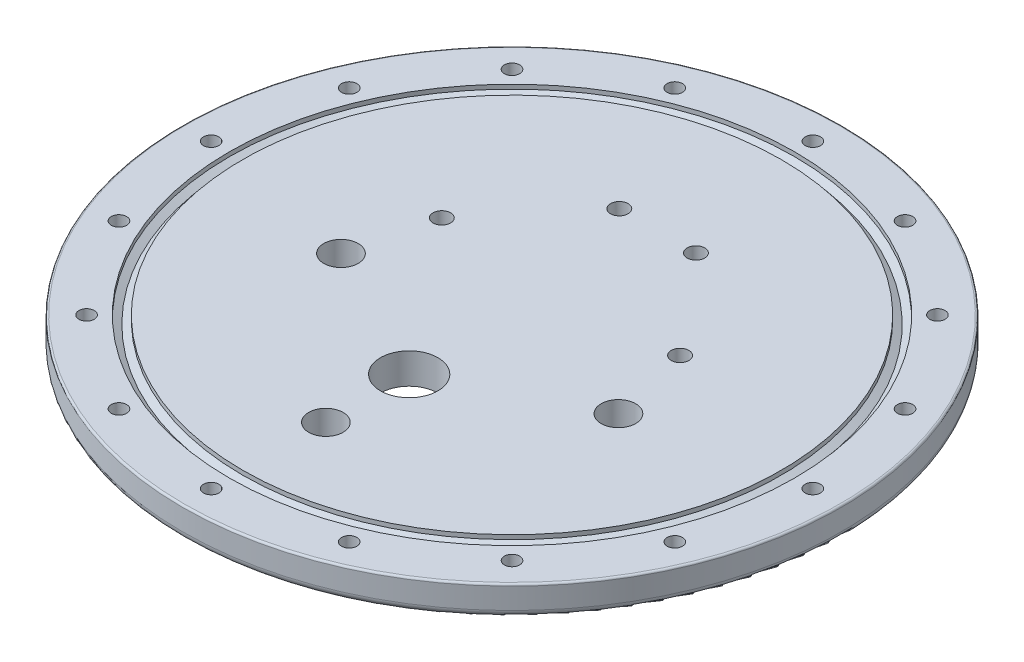
ISO-10303-21;
HEADER;
FILE_DESCRIPTION(('STEP AP214'),'2;1');
FILE_NAME('part.step','',(''),(''),'','','');
FILE_SCHEMA(('AUTOMOTIVE_DESIGN { 1 0 10303 214 1 1 1 1 }'));
ENDSEC;
DATA;
#1=APPLICATION_CONTEXT('core data for automotive mechanical design processes');
#2=APPLICATION_PROTOCOL_DEFINITION('international standard','automotive_design',2000,#1);
#3=PRODUCT_CONTEXT('',#1,'mechanical');
#4=PRODUCT('Part','Part','',(#3));
#5=PRODUCT_RELATED_PRODUCT_CATEGORY('part','',(#4));
#6=PRODUCT_DEFINITION_FORMATION('','',#4);
#7=PRODUCT_DEFINITION_CONTEXT('part definition',#1,'design');
#8=PRODUCT_DEFINITION('design','',#6,#7);
#9=PRODUCT_DEFINITION_SHAPE('','',#8);
#10=(LENGTH_UNIT() NAMED_UNIT(*) SI_UNIT(.MILLI.,.METRE.));
#11=(NAMED_UNIT(*) PLANE_ANGLE_UNIT() SI_UNIT($,.RADIAN.));
#12=(NAMED_UNIT(*) SI_UNIT($,.STERADIAN.) SOLID_ANGLE_UNIT());
#13=UNCERTAINTY_MEASURE_WITH_UNIT(LENGTH_MEASURE(1.E-05),#10,'distance_accuracy_value','');
#14=(GEOMETRIC_REPRESENTATION_CONTEXT(3) GLOBAL_UNCERTAINTY_ASSIGNED_CONTEXT((#13)) GLOBAL_UNIT_ASSIGNED_CONTEXT((#10,
#11,#12)) REPRESENTATION_CONTEXT('',''));
#15=CARTESIAN_POINT('',(0.,0.,0.));
#16=DIRECTION('',(0.,0.,1.));
#17=DIRECTION('',(1.,0.,0.));
#18=AXIS2_PLACEMENT_3D('',#15,#16,#17);
#19=CARTESIAN_POINT('',(0.,8.,0.));
#20=DIRECTION('',(0.,1.,0.));
#21=DIRECTION('',(0.,0.,1.));
#22=AXIS2_PLACEMENT_3D('',#19,#20,#21);
#23=PLANE('',#22);
#24=CARTESIAN_POINT('',(0.,8.,0.));
#25=DIRECTION('',(0.,1.,0.));
#26=DIRECTION('',(0.,0.,1.));
#27=AXIS2_PLACEMENT_3D('',#24,#25,#26);
#28=CIRCLE('',#27,85.5);
#29=CARTESIAN_POINT('',(0.,8.,85.5));
#30=VERTEX_POINT('',#29);
#31=EDGE_CURVE('E47',#30,#30,#28,.T.);
#32=ORIENTED_EDGE('',*,*,#31,.T.);
#33=EDGE_LOOP('',(#32));
#34=FACE_BOUND('',#33,.T.);
#35=CARTESIAN_POINT('',(-30.0406494406596,8.,-72.524543302136));
#36=DIRECTION('',(0.,1.,0.));
#37=DIRECTION('',(0.,0.,1.));
#38=AXIS2_PLACEMENT_3D('',#35,#36,#37);
#39=CIRCLE('',#38,2.);
#40=CARTESIAN_POINT('',(-30.0406494406596,8.,-70.524543302136));
#41=VERTEX_POINT('',#40);
#42=EDGE_CURVE('E69',#41,#41,#39,.T.);
#43=ORIENTED_EDGE('',*,*,#42,.F.);
#44=EDGE_LOOP('',(#43));
#45=FACE_BOUND('',#44,.T.);
#46=CARTESIAN_POINT('',(-55.507882323144,8.,-55.507882323144));
#47=DIRECTION('',(0.,1.,0.));
#48=DIRECTION('',(0.,0.,1.));
#49=AXIS2_PLACEMENT_3D('',#46,#47,#48);
#50=CIRCLE('',#49,2.);
#51=CARTESIAN_POINT('',(-55.507882323144,8.,-53.507882323144));
#52=VERTEX_POINT('',#51);
#53=EDGE_CURVE('E68',#52,#52,#50,.T.);
#54=ORIENTED_EDGE('',*,*,#53,.F.);
#55=EDGE_LOOP('',(#54));
#56=FACE_BOUND('',#55,.T.);
#57=CARTESIAN_POINT('',(-72.524543302136,8.,-30.0406494406596));
#58=DIRECTION('',(0.,1.,0.));
#59=DIRECTION('',(0.,0.,1.));
#60=AXIS2_PLACEMENT_3D('',#57,#58,#59);
#61=CIRCLE('',#60,2.);
#62=CARTESIAN_POINT('',(-72.524543302136,8.,-28.0406494406596));
#63=VERTEX_POINT('',#62);
#64=EDGE_CURVE('E78',#63,#63,#61,.T.);
#65=ORIENTED_EDGE('',*,*,#64,.F.);
#66=EDGE_LOOP('',(#65));
#67=FACE_BOUND('',#66,.T.);
#68=CARTESIAN_POINT('',(-78.5,8.,0.));
#69=DIRECTION('',(0.,1.,0.));
#70=DIRECTION('',(0.,0.,1.));
#71=AXIS2_PLACEMENT_3D('',#68,#69,#70);
#72=CIRCLE('',#71,2.);
#73=CARTESIAN_POINT('',(-78.5,8.,2.00000000000001));
#74=VERTEX_POINT('',#73);
#75=EDGE_CURVE('E86',#74,#74,#72,.T.);
#76=ORIENTED_EDGE('',*,*,#75,.F.);
#77=EDGE_LOOP('',(#76));
#78=FACE_BOUND('',#77,.T.);
#79=CARTESIAN_POINT('',(-72.524543302136,8.,30.0406494406596));
#80=DIRECTION('',(0.,1.,0.));
#81=DIRECTION('',(0.,0.,1.));
#82=AXIS2_PLACEMENT_3D('',#79,#80,#81);
#83=CIRCLE('',#82,2.);
#84=CARTESIAN_POINT('',(-72.524543302136,8.,32.0406494406596));
#85=VERTEX_POINT('',#84);
#86=EDGE_CURVE('E94',#85,#85,#83,.T.);
#87=ORIENTED_EDGE('',*,*,#86,.F.);
#88=EDGE_LOOP('',(#87));
#89=FACE_BOUND('',#88,.T.);
#90=CARTESIAN_POINT('',(-55.507882323144,8.,55.507882323144));
#91=DIRECTION('',(0.,1.,0.));
#92=DIRECTION('',(0.,0.,1.));
#93=AXIS2_PLACEMENT_3D('',#90,#91,#92);
#94=CIRCLE('',#93,2.);
#95=CARTESIAN_POINT('',(-55.507882323144,8.,57.507882323144));
#96=VERTEX_POINT('',#95);
#97=EDGE_CURVE('E102',#96,#96,#94,.T.);
#98=ORIENTED_EDGE('',*,*,#97,.F.);
#99=EDGE_LOOP('',(#98));
#100=FACE_BOUND('',#99,.T.);
#101=CARTESIAN_POINT('',(-30.0406494406595,8.,72.524543302136));
#102=DIRECTION('',(0.,1.,0.));
#103=DIRECTION('',(0.,0.,1.));
#104=AXIS2_PLACEMENT_3D('',#101,#102,#103);
#105=CIRCLE('',#104,2.00000000000001);
#106=CARTESIAN_POINT('',(-30.0406494406595,8.,74.524543302136));
#107=VERTEX_POINT('',#106);
#108=EDGE_CURVE('E110',#107,#107,#105,.T.);
#109=ORIENTED_EDGE('',*,*,#108,.F.);
#110=EDGE_LOOP('',(#109));
#111=FACE_BOUND('',#110,.T.);
#112=CARTESIAN_POINT('',(0.,8.,78.5));
#113=DIRECTION('',(0.,1.,0.));
#114=DIRECTION('',(0.,0.,1.));
#115=AXIS2_PLACEMENT_3D('',#112,#113,#114);
#116=CIRCLE('',#115,2.00000000000001);
#117=CARTESIAN_POINT('',(0.,8.,80.5));
#118=VERTEX_POINT('',#117);
#119=EDGE_CURVE('E118',#118,#118,#116,.T.);
#120=ORIENTED_EDGE('',*,*,#119,.F.);
#121=EDGE_LOOP('',(#120));
#122=FACE_BOUND('',#121,.T.);
#123=CARTESIAN_POINT('',(30.0406494406596,8.,72.524543302136));
#124=DIRECTION('',(0.,1.,0.));
#125=DIRECTION('',(0.,0.,1.));
#126=AXIS2_PLACEMENT_3D('',#123,#124,#125);
#127=CIRCLE('',#126,2.);
#128=CARTESIAN_POINT('',(30.0406494406596,8.,74.524543302136));
#129=VERTEX_POINT('',#128);
#130=EDGE_CURVE('E126',#129,#129,#127,.T.);
#131=ORIENTED_EDGE('',*,*,#130,.F.);
#132=EDGE_LOOP('',(#131));
#133=FACE_BOUND('',#132,.T.);
#134=CARTESIAN_POINT('',(55.507882323144,8.,55.507882323144));
#135=DIRECTION('',(0.,1.,0.));
#136=DIRECTION('',(0.,0.,1.));
#137=AXIS2_PLACEMENT_3D('',#134,#135,#136);
#138=CIRCLE('',#137,2.);
#139=CARTESIAN_POINT('',(55.507882323144,8.,57.507882323144));
#140=VERTEX_POINT('',#139);
#141=EDGE_CURVE('E134',#140,#140,#138,.T.);
#142=ORIENTED_EDGE('',*,*,#141,.F.);
#143=EDGE_LOOP('',(#142));
#144=FACE_BOUND('',#143,.T.);
#145=CARTESIAN_POINT('',(72.524543302136,8.,30.0406494406595));
#146=DIRECTION('',(0.,1.,0.));
#147=DIRECTION('',(0.,0.,1.));
#148=AXIS2_PLACEMENT_3D('',#145,#146,#147);
#149=CIRCLE('',#148,2.);
#150=CARTESIAN_POINT('',(72.524543302136,8.,32.0406494406595));
#151=VERTEX_POINT('',#150);
#152=EDGE_CURVE('E142',#151,#151,#149,.T.);
#153=ORIENTED_EDGE('',*,*,#152,.F.);
#154=EDGE_LOOP('',(#153));
#155=FACE_BOUND('',#154,.T.);
#156=CARTESIAN_POINT('',(78.5,8.,0.));
#157=DIRECTION('',(0.,1.,0.));
#158=DIRECTION('',(0.,0.,1.));
#159=AXIS2_PLACEMENT_3D('',#156,#157,#158);
#160=CIRCLE('',#159,2.);
#161=CARTESIAN_POINT('',(78.5,8.,1.99999999999999));
#162=VERTEX_POINT('',#161);
#163=EDGE_CURVE('E150',#162,#162,#160,.T.);
#164=ORIENTED_EDGE('',*,*,#163,.F.);
#165=EDGE_LOOP('',(#164));
#166=FACE_BOUND('',#165,.T.);
#167=CARTESIAN_POINT('',(72.524543302136,8.,-30.0406494406596));
#168=DIRECTION('',(0.,1.,0.));
#169=DIRECTION('',(0.,0.,1.));
#170=AXIS2_PLACEMENT_3D('',#167,#168,#169);
#171=CIRCLE('',#170,2.);
#172=CARTESIAN_POINT('',(72.524543302136,8.,-28.0406494406596));
#173=VERTEX_POINT('',#172);
#174=EDGE_CURVE('E158',#173,#173,#171,.T.);
#175=ORIENTED_EDGE('',*,*,#174,.F.);
#176=EDGE_LOOP('',(#175));
#177=FACE_BOUND('',#176,.T.);
#178=CARTESIAN_POINT('',(55.507882323144,8.,-55.507882323144));
#179=DIRECTION('',(0.,1.,0.));
#180=DIRECTION('',(0.,0.,1.));
#181=AXIS2_PLACEMENT_3D('',#178,#179,#180);
#182=CIRCLE('',#181,2.);
#183=CARTESIAN_POINT('',(55.507882323144,8.,-53.507882323144));
#184=VERTEX_POINT('',#183);
#185=EDGE_CURVE('E166',#184,#184,#182,.T.);
#186=ORIENTED_EDGE('',*,*,#185,.F.);
#187=EDGE_LOOP('',(#186));
#188=FACE_BOUND('',#187,.T.);
#189=CARTESIAN_POINT('',(30.0406494406595,8.,-72.524543302136));
#190=DIRECTION('',(0.,1.,0.));
#191=DIRECTION('',(0.,0.,1.));
#192=AXIS2_PLACEMENT_3D('',#189,#190,#191);
#193=CIRCLE('',#192,2.00000000000001);
#194=CARTESIAN_POINT('',(30.0406494406595,8.,-70.524543302136));
#195=VERTEX_POINT('',#194);
#196=EDGE_CURVE('E174',#195,#195,#193,.T.);
#197=ORIENTED_EDGE('',*,*,#196,.F.);
#198=EDGE_LOOP('',(#197));
#199=FACE_BOUND('',#198,.T.);
#200=CARTESIAN_POINT('',(0.,8.,-78.5));
#201=DIRECTION('',(0.,1.,0.));
#202=DIRECTION('',(0.,0.,1.));
#203=AXIS2_PLACEMENT_3D('',#200,#201,#202);
#204=CIRCLE('',#203,2.00000000000001);
#205=CARTESIAN_POINT('',(0.,8.,-76.5));
#206=VERTEX_POINT('',#205);
#207=EDGE_CURVE('E182',#206,#206,#204,.T.);
#208=ORIENTED_EDGE('',*,*,#207,.F.);
#209=EDGE_LOOP('',(#208));
#210=FACE_BOUND('',#209,.T.);
#211=CARTESIAN_POINT('',(0.,7.99999999999999,0.));
#212=DIRECTION('',(0.,-1.,0.));
#213=DIRECTION('',(0.,0.,-1.));
#214=AXIS2_PLACEMENT_3D('',#211,#212,#213);
#215=CIRCLE('',#214,73.75);
#216=CARTESIAN_POINT('',(0.,7.99999999999999,-73.75));
#217=VERTEX_POINT('',#216);
#218=EDGE_CURVE('E259',#217,#217,#215,.T.);
#219=ORIENTED_EDGE('',*,*,#218,.T.);
#220=EDGE_LOOP('',(#219));
#221=FACE_BOUND('',#220,.T.);
#222=ADVANCED_FACE('F39',(#34,#45,#56,#67,#78,#89,#100,#111,#122,#133,#144,#155,#166,#177,#188,
#199,#210,#221),#23,.T.);
#223=CARTESIAN_POINT('',(-10.,8.,-38.));
#224=DIRECTION('',(0.,1.,0.));
#225=DIRECTION('',(0.,0.,1.));
#226=AXIS2_PLACEMENT_3D('',#223,#224,#225);
#227=CIRCLE('',#226,2.3);
#228=CARTESIAN_POINT('',(-10.,8.,-35.7));
#229=VERTEX_POINT('',#228);
#230=EDGE_CURVE('E195',#229,#229,#227,.T.);
#231=ORIENTED_EDGE('',*,*,#230,.F.);
#232=EDGE_LOOP('',(#231));
#233=FACE_BOUND('',#232,.T.);
#234=CARTESIAN_POINT('',(9.99999999999999,8.,-38.));
#235=DIRECTION('',(0.,1.,0.));
#236=DIRECTION('',(0.,0.,1.));
#237=AXIS2_PLACEMENT_3D('',#234,#235,#236);
#238=CIRCLE('',#237,2.29999999999999);
#239=CARTESIAN_POINT('',(9.99999999999999,8.,-35.7));
#240=VERTEX_POINT('',#239);
#241=EDGE_CURVE('E214',#240,#240,#238,.T.);
#242=ORIENTED_EDGE('',*,*,#241,.F.);
#243=EDGE_LOOP('',(#242));
#244=FACE_BOUND('',#243,.T.);
#245=CARTESIAN_POINT('',(-31.0879930149172,8.,-12.7711120835518));
#246=DIRECTION('',(0.,1.,0.));
#247=DIRECTION('',(0.,0.,1.));
#248=AXIS2_PLACEMENT_3D('',#245,#246,#247);
#249=CIRCLE('',#248,2.3);
#250=CARTESIAN_POINT('',(-31.0879930149172,8.,-10.4711120835518));
#251=VERTEX_POINT('',#250);
#252=EDGE_CURVE('E204',#251,#251,#249,.T.);
#253=ORIENTED_EDGE('',*,*,#252,.F.);
#254=EDGE_LOOP('',(#253));
#255=FACE_BOUND('',#254,.T.);
#256=CARTESIAN_POINT('',(31.0921999181823,8.,-12.7711120835518));
#257=DIRECTION('',(0.,1.,0.));
#258=DIRECTION('',(0.,0.,1.));
#259=AXIS2_PLACEMENT_3D('',#256,#257,#258);
#260=CIRCLE('',#259,2.30000000000001);
#261=CARTESIAN_POINT('',(31.0921999181823,8.,-10.4711120835518));
#262=VERTEX_POINT('',#261);
#263=EDGE_CURVE('E205',#262,#262,#260,.T.);
#264=ORIENTED_EDGE('',*,*,#263,.F.);
#265=EDGE_LOOP('',(#264));
#266=FACE_BOUND('',#265,.T.);
#267=CARTESIAN_POINT('',(36.2000000000001,8.,8.42884336486898));
#268=DIRECTION('',(0.,1.,0.));
#269=DIRECTION('',(0.,0.,1.));
#270=AXIS2_PLACEMENT_3D('',#267,#268,#269);
#271=CIRCLE('',#270,4.49999999999996);
#272=CARTESIAN_POINT('',(36.2000000000001,8.,12.9288433648689));
#273=VERTEX_POINT('',#272);
#274=EDGE_CURVE('E228',#273,#273,#271,.T.);
#275=ORIENTED_EDGE('',*,*,#274,.F.);
#276=EDGE_LOOP('',(#275));
#277=FACE_BOUND('',#276,.T.);
#278=CARTESIAN_POINT('',(0.,8.,48.566515497247));
#279=DIRECTION('',(0.,1.,0.));
#280=DIRECTION('',(0.,0.,1.));
#281=AXIS2_PLACEMENT_3D('',#278,#279,#280);
#282=CIRCLE('',#281,4.5);
#283=CARTESIAN_POINT('',(0.,8.,53.066515497247));
#284=VERTEX_POINT('',#283);
#285=EDGE_CURVE('E229',#284,#284,#282,.T.);
#286=ORIENTED_EDGE('',*,*,#285,.F.);
#287=EDGE_LOOP('',(#286));
#288=FACE_BOUND('',#287,.T.);
#289=CARTESIAN_POINT('',(0.,8.,26.8267610305939));
#290=DIRECTION('',(0.,1.,0.));
#291=DIRECTION('',(0.,0.,1.));
#292=AXIS2_PLACEMENT_3D('',#289,#290,#291);
#293=CIRCLE('',#292,7.5);
#294=CARTESIAN_POINT('',(0.,8.,34.3267610305939));
#295=VERTEX_POINT('',#294);
#296=EDGE_CURVE('E245',#295,#295,#293,.T.);
#297=ORIENTED_EDGE('',*,*,#296,.F.);
#298=EDGE_LOOP('',(#297));
#299=FACE_BOUND('',#298,.T.);
#300=CARTESIAN_POINT('',(-36.2,8.,8.42884336486906));
#301=DIRECTION('',(0.,1.,0.));
#302=DIRECTION('',(0.,0.,1.));
#303=AXIS2_PLACEMENT_3D('',#300,#301,#302);
#304=CIRCLE('',#303,4.49999999999986);
#305=CARTESIAN_POINT('',(-36.2,8.,12.9288433648689));
#306=VERTEX_POINT('',#305);
#307=EDGE_CURVE('E238',#306,#306,#304,.T.);
#308=ORIENTED_EDGE('',*,*,#307,.F.);
#309=EDGE_LOOP('',(#308));
#310=FACE_BOUND('',#309,.T.);
#311=CARTESIAN_POINT('',(0.,8.,0.));
#312=DIRECTION('',(0.,-1.,0.));
#313=DIRECTION('',(0.,0.,-1.));
#314=AXIS2_PLACEMENT_3D('',#311,#312,#313);
#315=CIRCLE('',#314,70.25);
#316=CARTESIAN_POINT('',(0.,8.,-70.25));
#317=VERTEX_POINT('',#316);
#318=EDGE_CURVE('E263',#317,#317,#315,.T.);
#319=ORIENTED_EDGE('',*,*,#318,.F.);
#320=EDGE_LOOP('',(#319));
#321=FACE_BOUND('',#320,.T.);
#322=ADVANCED_FACE('F292',(#233,#244,#255,#266,#277,#288,#299,#310,#321),#23,.T.);
#323=CARTESIAN_POINT('',(0.,8.,0.));
#324=DIRECTION('',(0.,-1.,0.));
#325=DIRECTION('',(0.,0.,-1.));
#326=AXIS2_PLACEMENT_3D('',#323,#324,#325);
#327=CYLINDRICAL_SURFACE('',#326,86.);
#328=CARTESIAN_POINT('',(0.,7.5,0.));
#329=DIRECTION('',(0.,1.,0.));
#330=DIRECTION('',(0.,0.,1.));
#331=AXIS2_PLACEMENT_3D('',#328,#329,#330);
#332=CIRCLE('',#331,86.);
#333=CARTESIAN_POINT('',(0.,7.5,86.));
#334=VERTEX_POINT('',#333);
#335=EDGE_CURVE('E11',#334,#334,#332,.F.);
#336=ORIENTED_EDGE('',*,*,#335,.T.);
#337=EDGE_LOOP('',(#336));
#338=FACE_BOUND('',#337,.T.);
#339=CARTESIAN_POINT('',(0.,2.,0.));
#340=DIRECTION('',(0.,1.,0.));
#341=DIRECTION('',(0.,0.,1.));
#342=AXIS2_PLACEMENT_3D('',#339,#340,#341);
#343=CIRCLE('',#342,86.);
#344=CARTESIAN_POINT('',(0.,2.,86.));
#345=VERTEX_POINT('',#344);
#346=EDGE_CURVE('E57',#345,#345,#343,.T.);
#347=ORIENTED_EDGE('',*,*,#346,.T.);
#348=EDGE_LOOP('',(#347));
#349=FACE_BOUND('',#348,.T.);
#350=ADVANCED_FACE('F294',(#338,#349),#327,.T.);
#351=CARTESIAN_POINT('',(0.,0.,0.));
#352=DIRECTION('',(0.,1.,0.));
#353=DIRECTION('',(0.,0.,1.));
#354=AXIS2_PLACEMENT_3D('',#351,#352,#353);
#355=PLANE('',#354);
#356=CARTESIAN_POINT('',(0.,0.,0.));
#357=DIRECTION('',(0.,1.,0.));
#358=DIRECTION('',(0.,0.,1.));
#359=AXIS2_PLACEMENT_3D('',#356,#357,#358);
#360=CIRCLE('',#359,84.);
#361=CARTESIAN_POINT('',(0.,0.,84.));
#362=VERTEX_POINT('',#361);
#363=EDGE_CURVE('E52',#362,#362,#360,.F.);
#364=ORIENTED_EDGE('',*,*,#363,.T.);
#365=EDGE_LOOP('',(#364));
#366=FACE_BOUND('',#365,.T.);
#367=CARTESIAN_POINT('',(-36.2,0.,8.42884336486906));
#368=DIRECTION('',(0.,1.,0.));
#369=DIRECTION('',(0.,0.,1.));
#370=AXIS2_PLACEMENT_3D('',#367,#368,#369);
#371=CIRCLE('',#370,4.49999999999986);
#372=CARTESIAN_POINT('',(-36.2,0.,12.9288433648689));
#373=VERTEX_POINT('',#372);
#374=EDGE_CURVE('E209',#373,#373,#371,.F.);
#375=ORIENTED_EDGE('',*,*,#374,.F.);
#376=EDGE_LOOP('',(#375));
#377=FACE_BOUND('',#376,.T.);
#378=CARTESIAN_POINT('',(0.,0.,26.8267610305939));
#379=DIRECTION('',(0.,1.,0.));
#380=DIRECTION('',(0.,0.,1.));
#381=AXIS2_PLACEMENT_3D('',#378,#379,#380);
#382=CIRCLE('',#381,7.5);
#383=CARTESIAN_POINT('',(0.,0.,34.3267610305939));
#384=VERTEX_POINT('',#383);
#385=EDGE_CURVE('E233',#384,#384,#382,.F.);
#386=ORIENTED_EDGE('',*,*,#385,.F.);
#387=EDGE_LOOP('',(#386));
#388=FACE_BOUND('',#387,.T.);
#389=CARTESIAN_POINT('',(0.,0.,48.566515497247));
#390=DIRECTION('',(0.,1.,0.));
#391=DIRECTION('',(0.,0.,1.));
#392=AXIS2_PLACEMENT_3D('',#389,#390,#391);
#393=CIRCLE('',#392,4.5);
#394=CARTESIAN_POINT('',(0.,0.,53.066515497247));
#395=VERTEX_POINT('',#394);
#396=EDGE_CURVE('E224',#395,#395,#393,.F.);
#397=ORIENTED_EDGE('',*,*,#396,.F.);
#398=EDGE_LOOP('',(#397));
#399=FACE_BOUND('',#398,.T.);
#400=CARTESIAN_POINT('',(36.2000000000001,0.,8.42884336486898));
#401=DIRECTION('',(0.,1.,0.));
#402=DIRECTION('',(0.,0.,1.));
#403=AXIS2_PLACEMENT_3D('',#400,#401,#402);
#404=CIRCLE('',#403,4.49999999999996);
#405=CARTESIAN_POINT('',(36.2000000000001,0.,12.9288433648689));
#406=VERTEX_POINT('',#405);
#407=EDGE_CURVE('E234',#406,#406,#404,.F.);
#408=ORIENTED_EDGE('',*,*,#407,.F.);
#409=EDGE_LOOP('',(#408));
#410=FACE_BOUND('',#409,.T.);
#411=CARTESIAN_POINT('',(0.,0.,-78.5));
#412=DIRECTION('',(0.,1.,0.));
#413=DIRECTION('',(0.,0.,1.));
#414=AXIS2_PLACEMENT_3D('',#411,#412,#413);
#415=CIRCLE('',#414,2.00000000000001);
#416=CARTESIAN_POINT('',(0.,0.,-76.5));
#417=VERTEX_POINT('',#416);
#418=EDGE_CURVE('E63',#417,#417,#415,.F.);
#419=ORIENTED_EDGE('',*,*,#418,.F.);
#420=EDGE_LOOP('',(#419));
#421=FACE_BOUND('',#420,.T.);
#422=CARTESIAN_POINT('',(30.0406494406595,0.,-72.524543302136));
#423=DIRECTION('',(0.,1.,0.));
#424=DIRECTION('',(0.,0.,1.));
#425=AXIS2_PLACEMENT_3D('',#422,#423,#424);
#426=CIRCLE('',#425,2.00000000000001);
#427=CARTESIAN_POINT('',(30.0406494406595,0.,-70.524543302136));
#428=VERTEX_POINT('',#427);
#429=EDGE_CURVE('E178',#428,#428,#426,.F.);
#430=ORIENTED_EDGE('',*,*,#429,.F.);
#431=EDGE_LOOP('',(#430));
#432=FACE_BOUND('',#431,.T.);
#433=CARTESIAN_POINT('',(55.507882323144,0.,-55.507882323144));
#434=DIRECTION('',(0.,1.,0.));
#435=DIRECTION('',(0.,0.,1.));
#436=AXIS2_PLACEMENT_3D('',#433,#434,#435);
#437=CIRCLE('',#436,2.);
#438=CARTESIAN_POINT('',(55.507882323144,0.,-53.507882323144));
#439=VERTEX_POINT('',#438);
#440=EDGE_CURVE('E170',#439,#439,#437,.F.);
#441=ORIENTED_EDGE('',*,*,#440,.F.);
#442=EDGE_LOOP('',(#441));
#443=FACE_BOUND('',#442,.T.);
#444=CARTESIAN_POINT('',(72.524543302136,0.,-30.0406494406596));
#445=DIRECTION('',(0.,1.,0.));
#446=DIRECTION('',(0.,0.,1.));
#447=AXIS2_PLACEMENT_3D('',#444,#445,#446);
#448=CIRCLE('',#447,2.);
#449=CARTESIAN_POINT('',(72.524543302136,0.,-28.0406494406596));
#450=VERTEX_POINT('',#449);
#451=EDGE_CURVE('E162',#450,#450,#448,.F.);
#452=ORIENTED_EDGE('',*,*,#451,.F.);
#453=EDGE_LOOP('',(#452));
#454=FACE_BOUND('',#453,.T.);
#455=CARTESIAN_POINT('',(78.5,0.,0.));
#456=DIRECTION('',(0.,1.,0.));
#457=DIRECTION('',(0.,0.,1.));
#458=AXIS2_PLACEMENT_3D('',#455,#456,#457);
#459=CIRCLE('',#458,2.);
#460=CARTESIAN_POINT('',(78.5,0.,1.99999999999999));
#461=VERTEX_POINT('',#460);
#462=EDGE_CURVE('E154',#461,#461,#459,.F.);
#463=ORIENTED_EDGE('',*,*,#462,.F.);
#464=EDGE_LOOP('',(#463));
#465=FACE_BOUND('',#464,.T.);
#466=CARTESIAN_POINT('',(72.524543302136,0.,30.0406494406595));
#467=DIRECTION('',(0.,1.,0.));
#468=DIRECTION('',(0.,0.,1.));
#469=AXIS2_PLACEMENT_3D('',#466,#467,#468);
#470=CIRCLE('',#469,2.);
#471=CARTESIAN_POINT('',(72.524543302136,0.,32.0406494406595));
#472=VERTEX_POINT('',#471);
#473=EDGE_CURVE('E146',#472,#472,#470,.F.);
#474=ORIENTED_EDGE('',*,*,#473,.F.);
#475=EDGE_LOOP('',(#474));
#476=FACE_BOUND('',#475,.T.);
#477=CARTESIAN_POINT('',(55.507882323144,0.,55.507882323144));
#478=DIRECTION('',(0.,1.,0.));
#479=DIRECTION('',(0.,0.,1.));
#480=AXIS2_PLACEMENT_3D('',#477,#478,#479);
#481=CIRCLE('',#480,2.);
#482=CARTESIAN_POINT('',(55.507882323144,0.,57.507882323144));
#483=VERTEX_POINT('',#482);
#484=EDGE_CURVE('E138',#483,#483,#481,.F.);
#485=ORIENTED_EDGE('',*,*,#484,.F.);
#486=EDGE_LOOP('',(#485));
#487=FACE_BOUND('',#486,.T.);
#488=CARTESIAN_POINT('',(30.0406494406596,0.,72.524543302136));
#489=DIRECTION('',(0.,1.,0.));
#490=DIRECTION('',(0.,0.,1.));
#491=AXIS2_PLACEMENT_3D('',#488,#489,#490);
#492=CIRCLE('',#491,2.);
#493=CARTESIAN_POINT('',(30.0406494406596,0.,74.524543302136));
#494=VERTEX_POINT('',#493);
#495=EDGE_CURVE('E130',#494,#494,#492,.F.);
#496=ORIENTED_EDGE('',*,*,#495,.F.);
#497=EDGE_LOOP('',(#496));
#498=FACE_BOUND('',#497,.T.);
#499=CARTESIAN_POINT('',(0.,0.,78.5));
#500=DIRECTION('',(0.,1.,0.));
#501=DIRECTION('',(0.,0.,1.));
#502=AXIS2_PLACEMENT_3D('',#499,#500,#501);
#503=CIRCLE('',#502,2.00000000000001);
#504=CARTESIAN_POINT('',(0.,0.,80.5));
#505=VERTEX_POINT('',#504);
#506=EDGE_CURVE('E122',#505,#505,#503,.F.);
#507=ORIENTED_EDGE('',*,*,#506,.F.);
#508=EDGE_LOOP('',(#507));
#509=FACE_BOUND('',#508,.T.);
#510=CARTESIAN_POINT('',(-30.0406494406595,0.,72.524543302136));
#511=DIRECTION('',(0.,1.,0.));
#512=DIRECTION('',(0.,0.,1.));
#513=AXIS2_PLACEMENT_3D('',#510,#511,#512);
#514=CIRCLE('',#513,2.00000000000001);
#515=CARTESIAN_POINT('',(-30.0406494406595,0.,74.524543302136));
#516=VERTEX_POINT('',#515);
#517=EDGE_CURVE('E114',#516,#516,#514,.F.);
#518=ORIENTED_EDGE('',*,*,#517,.F.);
#519=EDGE_LOOP('',(#518));
#520=FACE_BOUND('',#519,.T.);
#521=CARTESIAN_POINT('',(-55.507882323144,0.,55.507882323144));
#522=DIRECTION('',(0.,1.,0.));
#523=DIRECTION('',(0.,0.,1.));
#524=AXIS2_PLACEMENT_3D('',#521,#522,#523);
#525=CIRCLE('',#524,2.);
#526=CARTESIAN_POINT('',(-55.507882323144,0.,57.507882323144));
#527=VERTEX_POINT('',#526);
#528=EDGE_CURVE('E106',#527,#527,#525,.F.);
#529=ORIENTED_EDGE('',*,*,#528,.F.);
#530=EDGE_LOOP('',(#529));
#531=FACE_BOUND('',#530,.T.);
#532=CARTESIAN_POINT('',(-72.524543302136,0.,30.0406494406596));
#533=DIRECTION('',(0.,1.,0.));
#534=DIRECTION('',(0.,0.,1.));
#535=AXIS2_PLACEMENT_3D('',#532,#533,#534);
#536=CIRCLE('',#535,2.);
#537=CARTESIAN_POINT('',(-72.524543302136,0.,32.0406494406596));
#538=VERTEX_POINT('',#537);
#539=EDGE_CURVE('E98',#538,#538,#536,.F.);
#540=ORIENTED_EDGE('',*,*,#539,.F.);
#541=EDGE_LOOP('',(#540));
#542=FACE_BOUND('',#541,.T.);
#543=CARTESIAN_POINT('',(-78.5,0.,0.));
#544=DIRECTION('',(0.,1.,0.));
#545=DIRECTION('',(0.,0.,1.));
#546=AXIS2_PLACEMENT_3D('',#543,#544,#545);
#547=CIRCLE('',#546,2.);
#548=CARTESIAN_POINT('',(-78.5,0.,2.00000000000001));
#549=VERTEX_POINT('',#548);
#550=EDGE_CURVE('E90',#549,#549,#547,.F.);
#551=ORIENTED_EDGE('',*,*,#550,.F.);
#552=EDGE_LOOP('',(#551));
#553=FACE_BOUND('',#552,.T.);
#554=CARTESIAN_POINT('',(-72.524543302136,0.,-30.0406494406596));
#555=DIRECTION('',(0.,1.,0.));
#556=DIRECTION('',(0.,0.,1.));
#557=AXIS2_PLACEMENT_3D('',#554,#555,#556);
#558=CIRCLE('',#557,2.);
#559=CARTESIAN_POINT('',(-72.524543302136,0.,-28.0406494406596));
#560=VERTEX_POINT('',#559);
#561=EDGE_CURVE('E82',#560,#560,#558,.F.);
#562=ORIENTED_EDGE('',*,*,#561,.F.);
#563=EDGE_LOOP('',(#562));
#564=FACE_BOUND('',#563,.T.);
#565=CARTESIAN_POINT('',(-55.507882323144,0.,-55.507882323144));
#566=DIRECTION('',(0.,1.,0.));
#567=DIRECTION('',(0.,0.,1.));
#568=AXIS2_PLACEMENT_3D('',#565,#566,#567);
#569=CIRCLE('',#568,2.);
#570=CARTESIAN_POINT('',(-55.507882323144,0.,-53.507882323144));
#571=VERTEX_POINT('',#570);
#572=EDGE_CURVE('E74',#571,#571,#569,.F.);
#573=ORIENTED_EDGE('',*,*,#572,.F.);
#574=EDGE_LOOP('',(#573));
#575=FACE_BOUND('',#574,.T.);
#576=CARTESIAN_POINT('',(-30.0406494406596,0.,-72.524543302136));
#577=DIRECTION('',(0.,1.,0.));
#578=DIRECTION('',(0.,0.,1.));
#579=AXIS2_PLACEMENT_3D('',#576,#577,#578);
#580=CIRCLE('',#579,2.);
#581=CARTESIAN_POINT('',(-30.0406494406596,0.,-70.524543302136));
#582=VERTEX_POINT('',#581);
#583=EDGE_CURVE('E64',#582,#582,#580,.F.);
#584=ORIENTED_EDGE('',*,*,#583,.F.);
#585=EDGE_LOOP('',(#584));
#586=FACE_BOUND('',#585,.T.);
#587=ADVANCED_FACE('F301',(#366,#377,#388,#399,#410,#421,#432,#443,#454,#465,#476,#487,#498,
#509,#520,#531,#542,#553,#564,#575,#586),#355,.F.);
#588=CARTESIAN_POINT('',(-30.0406494406596,-0.000999999999999265,-72.524543302136));
#589=DIRECTION('',(0.,1.,0.));
#590=DIRECTION('',(0.,0.,1.));
#591=AXIS2_PLACEMENT_3D('',#588,#589,#590);
#592=CYLINDRICAL_SURFACE('',#591,2.);
#593=ORIENTED_EDGE('',*,*,#42,.T.);
#594=EDGE_LOOP('',(#593));
#595=FACE_BOUND('',#594,.T.);
#596=ORIENTED_EDGE('',*,*,#583,.T.);
#597=EDGE_LOOP('',(#596));
#598=FACE_BOUND('',#597,.T.);
#599=ADVANCED_FACE('F307',(#595,#598),#592,.F.);
#600=CARTESIAN_POINT('',(-55.507882323144,-0.000999999999999265,-55.507882323144));
#601=DIRECTION('',(0.,1.,0.));
#602=DIRECTION('',(0.,0.,1.));
#603=AXIS2_PLACEMENT_3D('',#600,#601,#602);
#604=CYLINDRICAL_SURFACE('',#603,2.);
#605=ORIENTED_EDGE('',*,*,#53,.T.);
#606=EDGE_LOOP('',(#605));
#607=FACE_BOUND('',#606,.T.);
#608=ORIENTED_EDGE('',*,*,#572,.T.);
#609=EDGE_LOOP('',(#608));
#610=FACE_BOUND('',#609,.T.);
#611=ADVANCED_FACE('F363',(#607,#610),#604,.F.);
#612=CARTESIAN_POINT('',(-72.524543302136,-0.000999999999999265,-30.0406494406596));
#613=DIRECTION('',(0.,1.,0.));
#614=DIRECTION('',(0.,0.,1.));
#615=AXIS2_PLACEMENT_3D('',#612,#613,#614);
#616=CYLINDRICAL_SURFACE('',#615,2.);
#617=ORIENTED_EDGE('',*,*,#64,.T.);
#618=EDGE_LOOP('',(#617));
#619=FACE_BOUND('',#618,.T.);
#620=ORIENTED_EDGE('',*,*,#561,.T.);
#621=EDGE_LOOP('',(#620));
#622=FACE_BOUND('',#621,.T.);
#623=ADVANCED_FACE('F368',(#619,#622),#616,.F.);
#624=CARTESIAN_POINT('',(-78.5,-0.000999999999999265,0.));
#625=DIRECTION('',(0.,1.,0.));
#626=DIRECTION('',(0.,0.,1.));
#627=AXIS2_PLACEMENT_3D('',#624,#625,#626);
#628=CYLINDRICAL_SURFACE('',#627,2.);
#629=ORIENTED_EDGE('',*,*,#75,.T.);
#630=EDGE_LOOP('',(#629));
#631=FACE_BOUND('',#630,.T.);
#632=ORIENTED_EDGE('',*,*,#550,.T.);
#633=EDGE_LOOP('',(#632));
#634=FACE_BOUND('',#633,.T.);
#635=ADVANCED_FACE('F510',(#631,#634),#628,.F.);
#636=CARTESIAN_POINT('',(-72.524543302136,-0.000999999999999265,30.0406494406596));
#637=DIRECTION('',(0.,1.,0.));
#638=DIRECTION('',(0.,0.,1.));
#639=AXIS2_PLACEMENT_3D('',#636,#637,#638);
#640=CYLINDRICAL_SURFACE('',#639,2.);
#641=ORIENTED_EDGE('',*,*,#86,.T.);
#642=EDGE_LOOP('',(#641));
#643=FACE_BOUND('',#642,.T.);
#644=ORIENTED_EDGE('',*,*,#539,.T.);
#645=EDGE_LOOP('',(#644));
#646=FACE_BOUND('',#645,.T.);
#647=ADVANCED_FACE('F506',(#643,#646),#640,.F.);
#648=CARTESIAN_POINT('',(-55.507882323144,-0.000999999999999265,55.507882323144));
#649=DIRECTION('',(0.,1.,0.));
#650=DIRECTION('',(0.,0.,1.));
#651=AXIS2_PLACEMENT_3D('',#648,#649,#650);
#652=CYLINDRICAL_SURFACE('',#651,2.);
#653=ORIENTED_EDGE('',*,*,#97,.T.);
#654=EDGE_LOOP('',(#653));
#655=FACE_BOUND('',#654,.T.);
#656=ORIENTED_EDGE('',*,*,#528,.T.);
#657=EDGE_LOOP('',(#656));
#658=FACE_BOUND('',#657,.T.);
#659=ADVANCED_FACE('F502',(#655,#658),#652,.F.);
#660=CARTESIAN_POINT('',(-30.0406494406595,-0.000999999999999265,72.524543302136));
#661=DIRECTION('',(0.,1.,0.));
#662=DIRECTION('',(0.,0.,1.));
#663=AXIS2_PLACEMENT_3D('',#660,#661,#662);
#664=CYLINDRICAL_SURFACE('',#663,2.00000000000001);
#665=ORIENTED_EDGE('',*,*,#108,.T.);
#666=EDGE_LOOP('',(#665));
#667=FACE_BOUND('',#666,.T.);
#668=ORIENTED_EDGE('',*,*,#517,.T.);
#669=EDGE_LOOP('',(#668));
#670=FACE_BOUND('',#669,.T.);
#671=ADVANCED_FACE('F498',(#667,#670),#664,.F.);
#672=CARTESIAN_POINT('',(0.,-0.000999999999999265,78.5));
#673=DIRECTION('',(0.,1.,0.));
#674=DIRECTION('',(0.,0.,1.));
#675=AXIS2_PLACEMENT_3D('',#672,#673,#674);
#676=CYLINDRICAL_SURFACE('',#675,2.00000000000001);
#677=ORIENTED_EDGE('',*,*,#119,.T.);
#678=EDGE_LOOP('',(#677));
#679=FACE_BOUND('',#678,.T.);
#680=ORIENTED_EDGE('',*,*,#506,.T.);
#681=EDGE_LOOP('',(#680));
#682=FACE_BOUND('',#681,.T.);
#683=ADVANCED_FACE('F494',(#679,#682),#676,.F.);
#684=CARTESIAN_POINT('',(30.0406494406596,-0.000999999999999265,72.524543302136));
#685=DIRECTION('',(0.,1.,0.));
#686=DIRECTION('',(0.,0.,1.));
#687=AXIS2_PLACEMENT_3D('',#684,#685,#686);
#688=CYLINDRICAL_SURFACE('',#687,2.);
#689=ORIENTED_EDGE('',*,*,#130,.T.);
#690=EDGE_LOOP('',(#689));
#691=FACE_BOUND('',#690,.T.);
#692=ORIENTED_EDGE('',*,*,#495,.T.);
#693=EDGE_LOOP('',(#692));
#694=FACE_BOUND('',#693,.T.);
#695=ADVANCED_FACE('F490',(#691,#694),#688,.F.);
#696=CARTESIAN_POINT('',(55.507882323144,-0.000999999999999265,55.507882323144));
#697=DIRECTION('',(0.,1.,0.));
#698=DIRECTION('',(0.,0.,1.));
#699=AXIS2_PLACEMENT_3D('',#696,#697,#698);
#700=CYLINDRICAL_SURFACE('',#699,2.);
#701=ORIENTED_EDGE('',*,*,#141,.T.);
#702=EDGE_LOOP('',(#701));
#703=FACE_BOUND('',#702,.T.);
#704=ORIENTED_EDGE('',*,*,#484,.T.);
#705=EDGE_LOOP('',(#704));
#706=FACE_BOUND('',#705,.T.);
#707=ADVANCED_FACE('F486',(#703,#706),#700,.F.);
#708=CARTESIAN_POINT('',(72.524543302136,-0.000999999999999265,30.0406494406595));
#709=DIRECTION('',(0.,1.,0.));
#710=DIRECTION('',(0.,0.,1.));
#711=AXIS2_PLACEMENT_3D('',#708,#709,#710);
#712=CYLINDRICAL_SURFACE('',#711,2.);
#713=ORIENTED_EDGE('',*,*,#152,.T.);
#714=EDGE_LOOP('',(#713));
#715=FACE_BOUND('',#714,.T.);
#716=ORIENTED_EDGE('',*,*,#473,.T.);
#717=EDGE_LOOP('',(#716));
#718=FACE_BOUND('',#717,.T.);
#719=ADVANCED_FACE('F482',(#715,#718),#712,.F.);
#720=CARTESIAN_POINT('',(78.5,-0.000999999999999265,0.));
#721=DIRECTION('',(0.,1.,0.));
#722=DIRECTION('',(0.,0.,1.));
#723=AXIS2_PLACEMENT_3D('',#720,#721,#722);
#724=CYLINDRICAL_SURFACE('',#723,2.);
#725=ORIENTED_EDGE('',*,*,#163,.T.);
#726=EDGE_LOOP('',(#725));
#727=FACE_BOUND('',#726,.T.);
#728=ORIENTED_EDGE('',*,*,#462,.T.);
#729=EDGE_LOOP('',(#728));
#730=FACE_BOUND('',#729,.T.);
#731=ADVANCED_FACE('F478',(#727,#730),#724,.F.);
#732=CARTESIAN_POINT('',(72.524543302136,-0.000999999999999265,-30.0406494406596));
#733=DIRECTION('',(0.,1.,0.));
#734=DIRECTION('',(0.,0.,1.));
#735=AXIS2_PLACEMENT_3D('',#732,#733,#734);
#736=CYLINDRICAL_SURFACE('',#735,2.);
#737=ORIENTED_EDGE('',*,*,#174,.T.);
#738=EDGE_LOOP('',(#737));
#739=FACE_BOUND('',#738,.T.);
#740=ORIENTED_EDGE('',*,*,#451,.T.);
#741=EDGE_LOOP('',(#740));
#742=FACE_BOUND('',#741,.T.);
#743=ADVANCED_FACE('F474',(#739,#742),#736,.F.);
#744=CARTESIAN_POINT('',(55.507882323144,-0.000999999999999265,-55.507882323144));
#745=DIRECTION('',(0.,1.,0.));
#746=DIRECTION('',(0.,0.,1.));
#747=AXIS2_PLACEMENT_3D('',#744,#745,#746);
#748=CYLINDRICAL_SURFACE('',#747,2.);
#749=ORIENTED_EDGE('',*,*,#185,.T.);
#750=EDGE_LOOP('',(#749));
#751=FACE_BOUND('',#750,.T.);
#752=ORIENTED_EDGE('',*,*,#440,.T.);
#753=EDGE_LOOP('',(#752));
#754=FACE_BOUND('',#753,.T.);
#755=ADVANCED_FACE('F470',(#751,#754),#748,.F.);
#756=CARTESIAN_POINT('',(30.0406494406595,-0.000999999999999265,-72.524543302136));
#757=DIRECTION('',(0.,1.,0.));
#758=DIRECTION('',(0.,0.,1.));
#759=AXIS2_PLACEMENT_3D('',#756,#757,#758);
#760=CYLINDRICAL_SURFACE('',#759,2.00000000000001);
#761=ORIENTED_EDGE('',*,*,#196,.T.);
#762=EDGE_LOOP('',(#761));
#763=FACE_BOUND('',#762,.T.);
#764=ORIENTED_EDGE('',*,*,#429,.T.);
#765=EDGE_LOOP('',(#764));
#766=FACE_BOUND('',#765,.T.);
#767=ADVANCED_FACE('F466',(#763,#766),#760,.F.);
#768=CARTESIAN_POINT('',(0.,-0.000999999999999265,-78.5));
#769=DIRECTION('',(0.,1.,0.));
#770=DIRECTION('',(0.,0.,1.));
#771=AXIS2_PLACEMENT_3D('',#768,#769,#770);
#772=CYLINDRICAL_SURFACE('',#771,2.00000000000001);
#773=ORIENTED_EDGE('',*,*,#207,.T.);
#774=EDGE_LOOP('',(#773));
#775=FACE_BOUND('',#774,.T.);
#776=ORIENTED_EDGE('',*,*,#418,.T.);
#777=EDGE_LOOP('',(#776));
#778=FACE_BOUND('',#777,.T.);
#779=ADVANCED_FACE('F462',(#775,#778),#772,.F.);
#780=CARTESIAN_POINT('',(-10.,-6.50538238691626,-38.));
#781=DIRECTION('',(0.,1.,0.));
#782=DIRECTION('',(0.,0.,1.));
#783=AXIS2_PLACEMENT_3D('',#780,#781,#782);
#784=CYLINDRICAL_SURFACE('',#783,2.3);
#785=CARTESIAN_POINT('',(-10.,2.,-38.));
#786=DIRECTION('',(0.,1.,0.));
#787=DIRECTION('',(0.,0.,1.));
#788=AXIS2_PLACEMENT_3D('',#785,#786,#787);
#789=CIRCLE('',#788,2.3);
#790=CARTESIAN_POINT('',(-10.,2.,-35.7));
#791=VERTEX_POINT('',#790);
#792=EDGE_CURVE('E73',#791,#791,#789,.F.);
#793=ORIENTED_EDGE('',*,*,#792,.T.);
#794=EDGE_LOOP('',(#793));
#795=FACE_BOUND('',#794,.T.);
#796=ORIENTED_EDGE('',*,*,#230,.T.);
#797=EDGE_LOOP('',(#796));
#798=FACE_BOUND('',#797,.T.);
#799=ADVANCED_FACE('F458',(#795,#798),#784,.F.);
#800=CARTESIAN_POINT('',(0.,2.,0.));
#801=DIRECTION('',(0.,1.,0.));
#802=DIRECTION('',(0.,0.,1.));
#803=AXIS2_PLACEMENT_3D('',#800,#801,#802);
#804=PLANE('',#803);
#805=ORIENTED_EDGE('',*,*,#792,.F.);
#806=EDGE_LOOP('',(#805));
#807=FACE_BOUND('',#806,.T.);
#808=ADVANCED_FACE('F440',(#807),#804,.T.);
#809=CARTESIAN_POINT('',(9.99999999999999,-6.50538238691626,-38.));
#810=DIRECTION('',(0.,1.,0.));
#811=DIRECTION('',(0.,0.,1.));
#812=AXIS2_PLACEMENT_3D('',#809,#810,#811);
#813=CYLINDRICAL_SURFACE('',#812,2.29999999999999);
#814=CARTESIAN_POINT('',(9.99999999999999,2.,-38.));
#815=DIRECTION('',(0.,1.,0.));
#816=DIRECTION('',(0.,0.,1.));
#817=AXIS2_PLACEMENT_3D('',#814,#815,#816);
#818=CIRCLE('',#817,2.29999999999999);
#819=CARTESIAN_POINT('',(9.99999999999999,2.,-35.7));
#820=VERTEX_POINT('',#819);
#821=EDGE_CURVE('E199',#820,#820,#818,.F.);
#822=ORIENTED_EDGE('',*,*,#821,.T.);
#823=EDGE_LOOP('',(#822));
#824=FACE_BOUND('',#823,.T.);
#825=ORIENTED_EDGE('',*,*,#241,.T.);
#826=EDGE_LOOP('',(#825));
#827=FACE_BOUND('',#826,.T.);
#828=ADVANCED_FACE('F436',(#824,#827),#813,.F.);
#829=CARTESIAN_POINT('',(0.,2.,0.));
#830=DIRECTION('',(0.,1.,0.));
#831=DIRECTION('',(0.,0.,1.));
#832=AXIS2_PLACEMENT_3D('',#829,#830,#831);
#833=PLANE('',#832);
#834=ORIENTED_EDGE('',*,*,#821,.F.);
#835=EDGE_LOOP('',(#834));
#836=FACE_BOUND('',#835,.T.);
#837=ADVANCED_FACE('F432',(#836),#833,.T.);
#838=CARTESIAN_POINT('',(-31.0879930149172,-6.50538238691626,-12.7711120835518));
#839=DIRECTION('',(0.,1.,0.));
#840=DIRECTION('',(0.,0.,1.));
#841=AXIS2_PLACEMENT_3D('',#838,#839,#840);
#842=CYLINDRICAL_SURFACE('',#841,2.3);
#843=CARTESIAN_POINT('',(-31.0879930149172,2.,-12.7711120835518));
#844=DIRECTION('',(0.,1.,0.));
#845=DIRECTION('',(0.,0.,1.));
#846=AXIS2_PLACEMENT_3D('',#843,#844,#845);
#847=CIRCLE('',#846,2.3);
#848=CARTESIAN_POINT('',(-31.0879930149172,2.,-10.4711120835518));
#849=VERTEX_POINT('',#848);
#850=EDGE_CURVE('E210',#849,#849,#847,.F.);
#851=ORIENTED_EDGE('',*,*,#850,.T.);
#852=EDGE_LOOP('',(#851));
#853=FACE_BOUND('',#852,.T.);
#854=ORIENTED_EDGE('',*,*,#252,.T.);
#855=EDGE_LOOP('',(#854));
#856=FACE_BOUND('',#855,.T.);
#857=ADVANCED_FACE('F435',(#853,#856),#842,.F.);
#858=CARTESIAN_POINT('',(0.,2.,0.));
#859=DIRECTION('',(0.,1.,0.));
#860=DIRECTION('',(0.,0.,1.));
#861=AXIS2_PLACEMENT_3D('',#858,#859,#860);
#862=PLANE('',#861);
#863=ORIENTED_EDGE('',*,*,#850,.F.);
#864=EDGE_LOOP('',(#863));
#865=FACE_BOUND('',#864,.T.);
#866=ADVANCED_FACE('F442',(#865),#862,.T.);
#867=CARTESIAN_POINT('',(31.0921999181823,-6.50538238691626,-12.7711120835518));
#868=DIRECTION('',(0.,1.,0.));
#869=DIRECTION('',(0.,0.,1.));
#870=AXIS2_PLACEMENT_3D('',#867,#868,#869);
#871=CYLINDRICAL_SURFACE('',#870,2.30000000000001);
#872=CARTESIAN_POINT('',(31.0921999181823,2.,-12.7711120835518));
#873=DIRECTION('',(0.,1.,0.));
#874=DIRECTION('',(0.,0.,1.));
#875=AXIS2_PLACEMENT_3D('',#872,#873,#874);
#876=CIRCLE('',#875,2.30000000000001);
#877=CARTESIAN_POINT('',(31.0921999181823,2.,-10.4711120835518));
#878=VERTEX_POINT('',#877);
#879=EDGE_CURVE('E200',#878,#878,#876,.F.);
#880=ORIENTED_EDGE('',*,*,#879,.T.);
#881=EDGE_LOOP('',(#880));
#882=FACE_BOUND('',#881,.T.);
#883=ORIENTED_EDGE('',*,*,#263,.T.);
#884=EDGE_LOOP('',(#883));
#885=FACE_BOUND('',#884,.T.);
#886=ADVANCED_FACE('F445',(#882,#885),#871,.F.);
#887=CARTESIAN_POINT('',(0.,2.,0.));
#888=DIRECTION('',(0.,1.,0.));
#889=DIRECTION('',(0.,0.,1.));
#890=AXIS2_PLACEMENT_3D('',#887,#888,#889);
#891=PLANE('',#890);
#892=ORIENTED_EDGE('',*,*,#879,.F.);
#893=EDGE_LOOP('',(#892));
#894=FACE_BOUND('',#893,.T.);
#895=ADVANCED_FACE('F427',(#894),#891,.T.);
#896=CARTESIAN_POINT('',(36.2000000000001,-0.000999999999999265,8.42884336486898));
#897=DIRECTION('',(0.,1.,0.));
#898=DIRECTION('',(0.,0.,1.));
#899=AXIS2_PLACEMENT_3D('',#896,#897,#898);
#900=CYLINDRICAL_SURFACE('',#899,4.49999999999996);
#901=ORIENTED_EDGE('',*,*,#274,.T.);
#902=EDGE_LOOP('',(#901));
#903=FACE_BOUND('',#902,.T.);
#904=ORIENTED_EDGE('',*,*,#407,.T.);
#905=EDGE_LOOP('',(#904));
#906=FACE_BOUND('',#905,.T.);
#907=ADVANCED_FACE('F424',(#903,#906),#900,.F.);
#908=CARTESIAN_POINT('',(0.,-0.000999999999999265,48.566515497247));
#909=DIRECTION('',(0.,1.,0.));
#910=DIRECTION('',(0.,0.,1.));
#911=AXIS2_PLACEMENT_3D('',#908,#909,#910);
#912=CYLINDRICAL_SURFACE('',#911,4.5);
#913=ORIENTED_EDGE('',*,*,#285,.T.);
#914=EDGE_LOOP('',(#913));
#915=FACE_BOUND('',#914,.T.);
#916=ORIENTED_EDGE('',*,*,#396,.T.);
#917=EDGE_LOOP('',(#916));
#918=FACE_BOUND('',#917,.T.);
#919=ADVANCED_FACE('F422',(#915,#918),#912,.F.);
#920=CARTESIAN_POINT('',(0.,-0.000999999999999265,26.8267610305939));
#921=DIRECTION('',(0.,1.,0.));
#922=DIRECTION('',(0.,0.,1.));
#923=AXIS2_PLACEMENT_3D('',#920,#921,#922);
#924=CYLINDRICAL_SURFACE('',#923,7.5);
#925=ORIENTED_EDGE('',*,*,#296,.T.);
#926=EDGE_LOOP('',(#925));
#927=FACE_BOUND('',#926,.T.);
#928=ORIENTED_EDGE('',*,*,#385,.T.);
#929=EDGE_LOOP('',(#928));
#930=FACE_BOUND('',#929,.T.);
#931=ADVANCED_FACE('F416',(#927,#930),#924,.F.);
#932=CARTESIAN_POINT('',(-36.2,-0.000999999999999265,8.42884336486906));
#933=DIRECTION('',(0.,1.,0.));
#934=DIRECTION('',(0.,0.,1.));
#935=AXIS2_PLACEMENT_3D('',#932,#933,#934);
#936=CYLINDRICAL_SURFACE('',#935,4.49999999999986);
#937=ORIENTED_EDGE('',*,*,#307,.T.);
#938=EDGE_LOOP('',(#937));
#939=FACE_BOUND('',#938,.T.);
#940=ORIENTED_EDGE('',*,*,#374,.T.);
#941=EDGE_LOOP('',(#940));
#942=FACE_BOUND('',#941,.T.);
#943=ADVANCED_FACE('F411',(#939,#942),#936,.F.);
#944=CARTESIAN_POINT('',(0.,5.87000000000001,0.));
#945=DIRECTION('',(0.,1.,0.));
#946=DIRECTION('',(0.,0.,1.));
#947=AXIS2_PLACEMENT_3D('',#944,#945,#946);
#948=CONICAL_SURFACE('',#947,72.,1.04719755119662);
#949=CARTESIAN_POINT('',(0.,6.88036297108181,0.));
#950=DIRECTION('',(0.,-1.,0.));
#951=DIRECTION('',(0.,0.,-1.));
#952=AXIS2_PLACEMENT_3D('',#949,#950,#951);
#953=CIRCLE('',#952,73.75);
#954=CARTESIAN_POINT('',(0.,6.88036297108181,-73.75));
#955=VERTEX_POINT('',#954);
#956=EDGE_CURVE('E249',#955,#955,#953,.T.);
#957=ORIENTED_EDGE('',*,*,#956,.F.);
#958=EDGE_LOOP('',(#957));
#959=FACE_BOUND('',#958,.T.);
#960=CARTESIAN_POINT('',(0.,5.87000000000001,0.));
#961=DIRECTION('',(0.,-1.,0.));
#962=DIRECTION('',(0.,0.,-1.));
#963=AXIS2_PLACEMENT_3D('',#960,#961,#962);
#964=CIRCLE('',#963,72.);
#965=CARTESIAN_POINT('',(0.,5.87000000000001,-72.));
#966=VERTEX_POINT('',#965);
#967=EDGE_CURVE('E271',#966,#966,#964,.T.);
#968=ORIENTED_EDGE('',*,*,#967,.T.);
#969=EDGE_LOOP('',(#968));
#970=FACE_BOUND('',#969,.T.);
#971=ADVANCED_FACE('F276',(#959,#970),#948,.F.);
#972=CARTESIAN_POINT('',(0.,0.,0.));
#973=DIRECTION('',(0.,-1.,0.));
#974=DIRECTION('',(0.,0.,-1.));
#975=AXIS2_PLACEMENT_3D('',#972,#973,#974);
#976=CYLINDRICAL_SURFACE('',#975,73.75);
#977=ORIENTED_EDGE('',*,*,#218,.F.);
#978=EDGE_LOOP('',(#977));
#979=FACE_BOUND('',#978,.T.);
#980=ORIENTED_EDGE('',*,*,#956,.T.);
#981=EDGE_LOOP('',(#980));
#982=FACE_BOUND('',#981,.T.);
#983=ADVANCED_FACE('F288',(#979,#982),#976,.F.);
#984=CARTESIAN_POINT('',(0.,0.,0.));
#985=DIRECTION('',(0.,-1.,0.));
#986=DIRECTION('',(0.,0.,-1.));
#987=AXIS2_PLACEMENT_3D('',#984,#985,#986);
#988=CYLINDRICAL_SURFACE('',#987,70.25);
#989=CARTESIAN_POINT('',(0.,6.88036297108182,0.));
#990=DIRECTION('',(0.,-1.,0.));
#991=DIRECTION('',(0.,0.,-1.));
#992=AXIS2_PLACEMENT_3D('',#989,#990,#991);
#993=CIRCLE('',#992,70.25);
#994=CARTESIAN_POINT('',(0.,6.88036297108182,-70.25));
#995=VERTEX_POINT('',#994);
#996=EDGE_CURVE('E267',#995,#995,#993,.T.);
#997=ORIENTED_EDGE('',*,*,#996,.F.);
#998=EDGE_LOOP('',(#997));
#999=FACE_BOUND('',#998,.T.);
#1000=ORIENTED_EDGE('',*,*,#318,.T.);
#1001=EDGE_LOOP('',(#1000));
#1002=FACE_BOUND('',#1001,.T.);
#1003=ADVANCED_FACE('F282',(#999,#1002),#988,.T.);
#1004=CARTESIAN_POINT('',(0.,6.88036297108182,0.));
#1005=DIRECTION('',(0.,-1.,0.));
#1006=DIRECTION('',(0.,0.,-1.));
#1007=AXIS2_PLACEMENT_3D('',#1004,#1005,#1006);
#1008=CONICAL_SURFACE('',#1007,70.25,1.04719755119661);
#1009=ORIENTED_EDGE('',*,*,#967,.F.);
#1010=EDGE_LOOP('',(#1009));
#1011=FACE_BOUND('',#1010,.T.);
#1012=ORIENTED_EDGE('',*,*,#996,.T.);
#1013=EDGE_LOOP('',(#1012));
#1014=FACE_BOUND('',#1013,.T.);
#1015=ADVANCED_FACE('F278',(#1011,#1014),#1008,.T.);
#1016=CARTESIAN_POINT('',(0.,2.,0.));
#1017=DIRECTION('',(0.,1.,0.));
#1018=DIRECTION('',(0.,0.,1.));
#1019=AXIS2_PLACEMENT_3D('',#1016,#1017,#1018);
#1020=TOROIDAL_SURFACE('',#1019,84.,2.);
#1021=ORIENTED_EDGE('',*,*,#363,.F.);
#1022=EDGE_LOOP('',(#1021));
#1023=FACE_BOUND('',#1022,.T.);
#1024=ORIENTED_EDGE('',*,*,#346,.F.);
#1025=EDGE_LOOP('',(#1024));
#1026=FACE_BOUND('',#1025,.T.);
#1027=ADVANCED_FACE('F281',(#1023,#1026),#1020,.T.);
#1028=CARTESIAN_POINT('',(0.,7.5,0.));
#1029=DIRECTION('',(0.,1.,0.));
#1030=DIRECTION('',(0.,0.,1.));
#1031=AXIS2_PLACEMENT_3D('',#1028,#1029,#1030);
#1032=TOROIDAL_SURFACE('',#1031,85.5,0.5);
#1033=ORIENTED_EDGE('',*,*,#335,.F.);
#1034=EDGE_LOOP('',(#1033));
#1035=FACE_BOUND('',#1034,.T.);
#1036=ORIENTED_EDGE('',*,*,#31,.F.);
#1037=EDGE_LOOP('',(#1036));
#1038=FACE_BOUND('',#1037,.T.);
#1039=ADVANCED_FACE('F41',(#1035,#1038),#1032,.T.);
#1040=CLOSED_SHELL('',(#222,#322,#350,#587,#599,#611,#623,#635,#647,#659,#671,#683,#695,#707,
#719,#731,#743,#755,#767,#779,#799,#808,#828,#837,#857,#866,#886,#895,#907,#919,#931,#943,#971,
#983,#1003,#1015,#1027,#1039));
#1041=MANIFOLD_SOLID_BREP('B2',#1040);
#1042=ADVANCED_BREP_SHAPE_REPRESENTATION('',(#18,#1041),#14);
#1043=SHAPE_DEFINITION_REPRESENTATION(#9,#1042);
ENDSEC;
END-ISO-10303-21;
